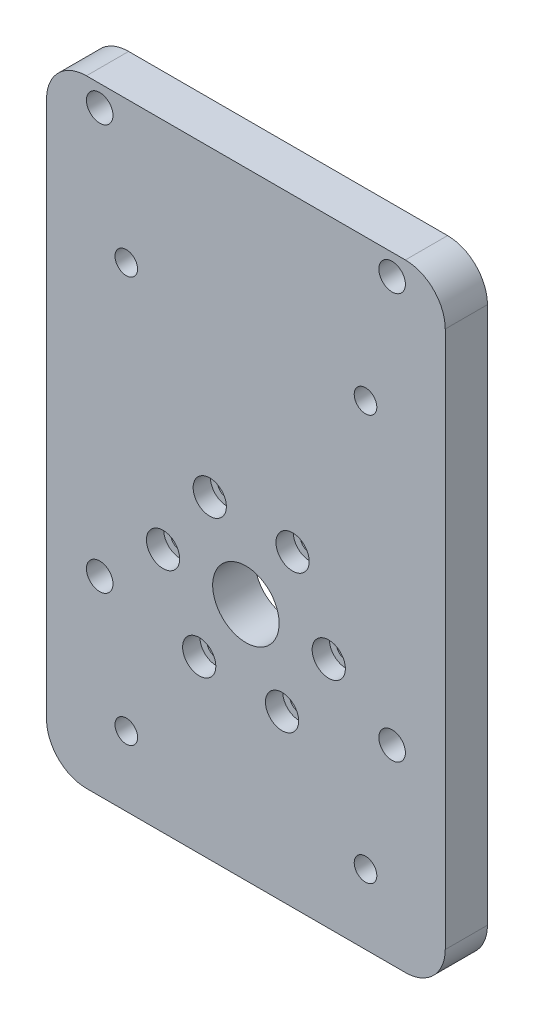
ISO-10303-21;
HEADER;
FILE_DESCRIPTION(('STEP AP214'),'2;1');
FILE_NAME('part.step','',(''),(''),'','','');
FILE_SCHEMA(('AUTOMOTIVE_DESIGN { 1 0 10303 214 1 1 1 1 }'));
ENDSEC;
DATA;
#1=APPLICATION_CONTEXT('core data for automotive mechanical design processes');
#2=APPLICATION_PROTOCOL_DEFINITION('international standard','automotive_design',2000,#1);
#3=PRODUCT_CONTEXT('',#1,'mechanical');
#4=PRODUCT('Part','Part','',(#3));
#5=PRODUCT_RELATED_PRODUCT_CATEGORY('part','',(#4));
#6=PRODUCT_DEFINITION_FORMATION('','',#4);
#7=PRODUCT_DEFINITION_CONTEXT('part definition',#1,'design');
#8=PRODUCT_DEFINITION('design','',#6,#7);
#9=PRODUCT_DEFINITION_SHAPE('','',#8);
#10=(LENGTH_UNIT() NAMED_UNIT(*) SI_UNIT(.MILLI.,.METRE.));
#11=(NAMED_UNIT(*) PLANE_ANGLE_UNIT() SI_UNIT($,.RADIAN.));
#12=(NAMED_UNIT(*) SI_UNIT($,.STERADIAN.) SOLID_ANGLE_UNIT());
#13=UNCERTAINTY_MEASURE_WITH_UNIT(LENGTH_MEASURE(1.E-05),#10,'distance_accuracy_value','');
#14=(GEOMETRIC_REPRESENTATION_CONTEXT(3) GLOBAL_UNCERTAINTY_ASSIGNED_CONTEXT((#13)) GLOBAL_UNIT_ASSIGNED_CONTEXT((#10,
#11,#12)) REPRESENTATION_CONTEXT('',''));
#15=CARTESIAN_POINT('',(0.,0.,0.));
#16=DIRECTION('',(0.,0.,1.));
#17=DIRECTION('',(1.,0.,0.));
#18=AXIS2_PLACEMENT_3D('',#15,#16,#17);
#19=CARTESIAN_POINT('',(159.426042223152,10.338507178432,275.95));
#20=DIRECTION('',(0.,0.,-1.));
#21=DIRECTION('',(-1.,0.,0.));
#22=AXIS2_PLACEMENT_3D('',#19,#20,#21);
#23=CYLINDRICAL_SURFACE('',#22,1.45000000000001);
#24=CARTESIAN_POINT('',(159.426042223152,10.338507178432,269.6));
#25=DIRECTION('',(0.,0.,1.));
#26=DIRECTION('',(1.,0.,0.));
#27=AXIS2_PLACEMENT_3D('',#24,#25,#26);
#28=CIRCLE('',#27,1.45000000000001);
#29=CARTESIAN_POINT('',(160.876042223152,10.338507178432,269.6));
#30=VERTEX_POINT('',#29);
#31=EDGE_CURVE('E153',#30,#30,#28,.T.);
#32=ORIENTED_EDGE('',*,*,#31,.F.);
#33=EDGE_LOOP('',(#32));
#34=FACE_BOUND('',#33,.T.);
#35=CARTESIAN_POINT('',(159.426042223152,10.338507178432,273.35));
#36=DIRECTION('',(0.,0.,1.));
#37=DIRECTION('',(1.,0.,0.));
#38=AXIS2_PLACEMENT_3D('',#35,#36,#37);
#39=CIRCLE('',#38,1.45000000000001);
#40=CARTESIAN_POINT('',(160.876042223152,10.338507178432,273.35));
#41=VERTEX_POINT('',#40);
#42=EDGE_CURVE('E47',#41,#41,#39,.T.);
#43=ORIENTED_EDGE('',*,*,#42,.T.);
#44=EDGE_LOOP('',(#43));
#45=FACE_BOUND('',#44,.T.);
#46=ADVANCED_FACE('F44',(#34,#45),#23,.F.);
#47=CARTESIAN_POINT('',(146.959611257846,11.2539846425274,275.95));
#48=DIRECTION('',(0.,0.,-1.));
#49=DIRECTION('',(-1.,0.,0.));
#50=AXIS2_PLACEMENT_3D('',#47,#48,#49);
#51=CYLINDRICAL_SURFACE('',#50,1.45000000000001);
#52=CARTESIAN_POINT('',(146.959611257846,11.2539846425274,269.6));
#53=DIRECTION('',(0.,0.,1.));
#54=DIRECTION('',(1.,0.,0.));
#55=AXIS2_PLACEMENT_3D('',#52,#53,#54);
#56=CIRCLE('',#55,1.45000000000001);
#57=CARTESIAN_POINT('',(148.409611257846,11.2539846425274,269.6));
#58=VERTEX_POINT('',#57);
#59=EDGE_CURVE('E245',#58,#58,#56,.T.);
#60=ORIENTED_EDGE('',*,*,#59,.F.);
#61=EDGE_LOOP('',(#60));
#62=FACE_BOUND('',#61,.T.);
#63=CARTESIAN_POINT('',(146.959611257846,11.2539846425274,273.35));
#64=DIRECTION('',(0.,0.,1.));
#65=DIRECTION('',(1.,0.,0.));
#66=AXIS2_PLACEMENT_3D('',#63,#64,#65);
#67=CIRCLE('',#66,1.45000000000001);
#68=CARTESIAN_POINT('',(148.409611257846,11.2539846425274,273.35));
#69=VERTEX_POINT('',#68);
#70=EDGE_CURVE('E207',#69,#69,#67,.T.);
#71=ORIENTED_EDGE('',*,*,#70,.T.);
#72=EDGE_LOOP('',(#71));
#73=FACE_BOUND('',#72,.T.);
#74=ADVANCED_FACE('F394',(#62,#73),#51,.F.);
#75=CARTESIAN_POINT('',(139.933569034694,0.915477464095396,275.95));
#76=DIRECTION('',(0.,0.,-1.));
#77=DIRECTION('',(-1.,0.,0.));
#78=AXIS2_PLACEMENT_3D('',#75,#76,#77);
#79=CYLINDRICAL_SURFACE('',#78,1.45000000000001);
#80=CARTESIAN_POINT('',(139.933569034694,0.915477464095396,269.6));
#81=DIRECTION('',(0.,0.,1.));
#82=DIRECTION('',(1.,0.,0.));
#83=AXIS2_PLACEMENT_3D('',#80,#81,#82);
#84=CIRCLE('',#83,1.45000000000001);
#85=CARTESIAN_POINT('',(141.383569034694,0.915477464095396,269.6));
#86=VERTEX_POINT('',#85);
#87=EDGE_CURVE('E246',#86,#86,#84,.T.);
#88=ORIENTED_EDGE('',*,*,#87,.F.);
#89=EDGE_LOOP('',(#88));
#90=FACE_BOUND('',#89,.T.);
#91=CARTESIAN_POINT('',(139.933569034694,0.915477464095396,273.35));
#92=DIRECTION('',(0.,0.,1.));
#93=DIRECTION('',(1.,0.,0.));
#94=AXIS2_PLACEMENT_3D('',#91,#92,#93);
#95=CIRCLE('',#94,1.45000000000001);
#96=CARTESIAN_POINT('',(141.383569034694,0.915477464095396,273.35));
#97=VERTEX_POINT('',#96);
#98=EDGE_CURVE('E202',#97,#97,#95,.T.);
#99=ORIENTED_EDGE('',*,*,#98,.T.);
#100=EDGE_LOOP('',(#99));
#101=FACE_BOUND('',#100,.T.);
#102=ADVANCED_FACE('F405',(#90,#101),#79,.F.);
#103=CARTESIAN_POINT('',(145.373957776848,-10.338507178432,275.95));
#104=DIRECTION('',(0.,0.,-1.));
#105=DIRECTION('',(-1.,0.,0.));
#106=AXIS2_PLACEMENT_3D('',#103,#104,#105);
#107=CYLINDRICAL_SURFACE('',#106,1.45000000000001);
#108=CARTESIAN_POINT('',(145.373957776848,-10.338507178432,269.6));
#109=DIRECTION('',(0.,0.,1.));
#110=DIRECTION('',(1.,0.,0.));
#111=AXIS2_PLACEMENT_3D('',#108,#109,#110);
#112=CIRCLE('',#111,1.45000000000001);
#113=CARTESIAN_POINT('',(146.823957776848,-10.338507178432,269.6));
#114=VERTEX_POINT('',#113);
#115=EDGE_CURVE('E249',#114,#114,#112,.T.);
#116=ORIENTED_EDGE('',*,*,#115,.F.);
#117=EDGE_LOOP('',(#116));
#118=FACE_BOUND('',#117,.T.);
#119=CARTESIAN_POINT('',(145.373957776848,-10.338507178432,273.35));
#120=DIRECTION('',(0.,0.,1.));
#121=DIRECTION('',(1.,0.,0.));
#122=AXIS2_PLACEMENT_3D('',#119,#120,#121);
#123=CIRCLE('',#122,1.45000000000001);
#124=CARTESIAN_POINT('',(146.823957776848,-10.338507178432,273.35));
#125=VERTEX_POINT('',#124);
#126=EDGE_CURVE('E198',#125,#125,#123,.T.);
#127=ORIENTED_EDGE('',*,*,#126,.T.);
#128=EDGE_LOOP('',(#127));
#129=FACE_BOUND('',#128,.T.);
#130=ADVANCED_FACE('F465',(#118,#129),#107,.F.);
#131=CARTESIAN_POINT('',(157.840388742154,-11.2539846425274,275.95));
#132=DIRECTION('',(0.,0.,-1.));
#133=DIRECTION('',(-1.,0.,0.));
#134=AXIS2_PLACEMENT_3D('',#131,#132,#133);
#135=CYLINDRICAL_SURFACE('',#134,1.45000000000001);
#136=CARTESIAN_POINT('',(157.840388742154,-11.2539846425274,269.6));
#137=DIRECTION('',(0.,0.,1.));
#138=DIRECTION('',(1.,0.,0.));
#139=AXIS2_PLACEMENT_3D('',#136,#137,#138);
#140=CIRCLE('',#139,1.45000000000001);
#141=CARTESIAN_POINT('',(159.290388742154,-11.2539846425274,269.6));
#142=VERTEX_POINT('',#141);
#143=EDGE_CURVE('E235',#142,#142,#140,.T.);
#144=ORIENTED_EDGE('',*,*,#143,.F.);
#145=EDGE_LOOP('',(#144));
#146=FACE_BOUND('',#145,.T.);
#147=CARTESIAN_POINT('',(157.840388742154,-11.2539846425274,273.35));
#148=DIRECTION('',(0.,0.,1.));
#149=DIRECTION('',(1.,0.,0.));
#150=AXIS2_PLACEMENT_3D('',#147,#148,#149);
#151=CIRCLE('',#150,1.45000000000001);
#152=CARTESIAN_POINT('',(159.290388742154,-11.2539846425274,273.35));
#153=VERTEX_POINT('',#152);
#154=EDGE_CURVE('E194',#153,#153,#151,.T.);
#155=ORIENTED_EDGE('',*,*,#154,.T.);
#156=EDGE_LOOP('',(#155));
#157=FACE_BOUND('',#156,.T.);
#158=ADVANCED_FACE('F406',(#146,#157),#135,.F.);
#159=CARTESIAN_POINT('',(164.866430965306,-0.915477464095398,275.95));
#160=DIRECTION('',(0.,0.,-1.));
#161=DIRECTION('',(-1.,0.,0.));
#162=AXIS2_PLACEMENT_3D('',#159,#160,#161);
#163=CYLINDRICAL_SURFACE('',#162,1.45000000000001);
#164=CARTESIAN_POINT('',(164.866430965306,-0.915477464095398,269.6));
#165=DIRECTION('',(0.,0.,1.));
#166=DIRECTION('',(1.,0.,0.));
#167=AXIS2_PLACEMENT_3D('',#164,#165,#166);
#168=CIRCLE('',#167,1.45000000000001);
#169=CARTESIAN_POINT('',(166.316430965306,-0.915477464095398,269.6));
#170=VERTEX_POINT('',#169);
#171=EDGE_CURVE('E226',#170,#170,#168,.T.);
#172=ORIENTED_EDGE('',*,*,#171,.F.);
#173=EDGE_LOOP('',(#172));
#174=FACE_BOUND('',#173,.T.);
#175=CARTESIAN_POINT('',(164.866430965306,-0.915477464095398,273.35));
#176=DIRECTION('',(0.,0.,1.));
#177=DIRECTION('',(1.,0.,0.));
#178=AXIS2_PLACEMENT_3D('',#175,#176,#177);
#179=CIRCLE('',#178,1.45000000000001);
#180=CARTESIAN_POINT('',(166.316430965306,-0.915477464095398,273.35));
#181=VERTEX_POINT('',#180);
#182=EDGE_CURVE('E188',#181,#181,#179,.T.);
#183=ORIENTED_EDGE('',*,*,#182,.T.);
#184=EDGE_LOOP('',(#183));
#185=FACE_BOUND('',#184,.T.);
#186=ADVANCED_FACE('F439',(#174,#185),#163,.F.);
#187=CARTESIAN_POINT('',(128.4,-30.,275.95));
#188=DIRECTION('',(0.,0.,-1.));
#189=DIRECTION('',(-1.,0.,0.));
#190=AXIS2_PLACEMENT_3D('',#187,#188,#189);
#191=CYLINDRICAL_SURFACE('',#190,6.00000000000001);
#192=CARTESIAN_POINT('',(128.4,-30.,269.6));
#193=DIRECTION('',(0.,0.,1.));
#194=DIRECTION('',(1.,0.,0.));
#195=AXIS2_PLACEMENT_3D('',#192,#193,#194);
#196=CIRCLE('',#195,6.00000000000001);
#197=CARTESIAN_POINT('',(122.4,-30.,269.6));
#198=VERTEX_POINT('',#197);
#199=CARTESIAN_POINT('',(128.4,-36.,269.6));
#200=VERTEX_POINT('',#199);
#201=EDGE_CURVE('E149',#198,#200,#196,.T.);
#202=ORIENTED_EDGE('',*,*,#201,.T.);
#203=DIRECTION('',(0.,0.,-1.));
#204=VECTOR('',#203,1.);
#205=CARTESIAN_POINT('',(128.4,-36.,275.95));
#206=LINE('',#205,#204);
#207=CARTESIAN_POINT('',(128.4,-36.,275.95));
#208=VERTEX_POINT('',#207);
#209=EDGE_CURVE('E11',#208,#200,#206,.T.);
#210=ORIENTED_EDGE('',*,*,#209,.F.);
#211=CARTESIAN_POINT('',(128.4,-30.,275.95));
#212=DIRECTION('',(0.,0.,1.));
#213=DIRECTION('',(1.,0.,0.));
#214=AXIS2_PLACEMENT_3D('',#211,#212,#213);
#215=CIRCLE('',#214,6.00000000000001);
#216=CARTESIAN_POINT('',(122.4,-30.,275.95));
#217=VERTEX_POINT('',#216);
#218=EDGE_CURVE('E175',#217,#208,#215,.T.);
#219=ORIENTED_EDGE('',*,*,#218,.F.);
#220=DIRECTION('',(0.,0.,-1.));
#221=VECTOR('',#220,1.);
#222=CARTESIAN_POINT('',(122.4,-30.,275.95));
#223=LINE('',#222,#221);
#224=EDGE_CURVE('E143',#217,#198,#223,.T.);
#225=ORIENTED_EDGE('',*,*,#224,.T.);
#226=EDGE_LOOP('',(#202,#210,#219,#225));
#227=FACE_BOUND('',#226,.T.);
#228=ADVANCED_FACE('F50',(#227),#191,.T.);
#229=CARTESIAN_POINT('',(128.4,-36.,275.95));
#230=DIRECTION('',(0.,1.,0.));
#231=DIRECTION('',(0.,0.,1.));
#232=AXIS2_PLACEMENT_3D('',#229,#230,#231);
#233=PLANE('',#232);
#234=DIRECTION('',(1.,0.,0.));
#235=VECTOR('',#234,1.);
#236=CARTESIAN_POINT('',(128.4,-36.,269.6));
#237=LINE('',#236,#235);
#238=CARTESIAN_POINT('',(176.4,-36.,269.6));
#239=VERTEX_POINT('',#238);
#240=EDGE_CURVE('E152',#200,#239,#237,.T.);
#241=ORIENTED_EDGE('',*,*,#240,.T.);
#242=DIRECTION('',(0.,0.,-1.));
#243=VECTOR('',#242,1.);
#244=CARTESIAN_POINT('',(176.4,-36.,275.95));
#245=LINE('',#244,#243);
#246=CARTESIAN_POINT('',(176.4,-36.,275.95));
#247=VERTEX_POINT('',#246);
#248=EDGE_CURVE('E57',#247,#239,#245,.T.);
#249=ORIENTED_EDGE('',*,*,#248,.F.);
#250=DIRECTION('',(1.,0.,0.));
#251=VECTOR('',#250,1.);
#252=CARTESIAN_POINT('',(128.4,-36.,275.95));
#253=LINE('',#252,#251);
#254=EDGE_CURVE('E108',#208,#247,#253,.T.);
#255=ORIENTED_EDGE('',*,*,#254,.F.);
#256=ORIENTED_EDGE('',*,*,#209,.T.);
#257=EDGE_LOOP('',(#241,#249,#255,#256));
#258=FACE_BOUND('',#257,.T.);
#259=ADVANCED_FACE('F432',(#258),#233,.F.);
#260=CARTESIAN_POINT('',(176.4,-30.,275.95));
#261=DIRECTION('',(0.,0.,-1.));
#262=DIRECTION('',(-1.,0.,0.));
#263=AXIS2_PLACEMENT_3D('',#260,#261,#262);
#264=CYLINDRICAL_SURFACE('',#263,6.00000000000001);
#265=CARTESIAN_POINT('',(176.4,-30.,269.6));
#266=DIRECTION('',(0.,0.,1.));
#267=DIRECTION('',(1.,0.,0.));
#268=AXIS2_PLACEMENT_3D('',#265,#266,#267);
#269=CIRCLE('',#268,6.00000000000001);
#270=CARTESIAN_POINT('',(182.4,-30.,269.6));
#271=VERTEX_POINT('',#270);
#272=EDGE_CURVE('E160',#239,#271,#269,.T.);
#273=ORIENTED_EDGE('',*,*,#272,.T.);
#274=DIRECTION('',(0.,0.,-1.));
#275=VECTOR('',#274,1.);
#276=CARTESIAN_POINT('',(182.4,-30.,275.95));
#277=LINE('',#276,#275);
#278=CARTESIAN_POINT('',(182.4,-30.,275.95));
#279=VERTEX_POINT('',#278);
#280=EDGE_CURVE('E182',#279,#271,#277,.T.);
#281=ORIENTED_EDGE('',*,*,#280,.F.);
#282=CARTESIAN_POINT('',(176.4,-30.,275.95));
#283=DIRECTION('',(0.,0.,1.));
#284=DIRECTION('',(1.,0.,0.));
#285=AXIS2_PLACEMENT_3D('',#282,#283,#284);
#286=CIRCLE('',#285,6.00000000000001);
#287=EDGE_CURVE('E263',#247,#279,#286,.T.);
#288=ORIENTED_EDGE('',*,*,#287,.F.);
#289=ORIENTED_EDGE('',*,*,#248,.T.);
#290=EDGE_LOOP('',(#273,#281,#288,#289));
#291=FACE_BOUND('',#290,.T.);
#292=ADVANCED_FACE('F431',(#291),#264,.T.);
#293=CARTESIAN_POINT('',(182.4,-30.,275.95));
#294=DIRECTION('',(-1.,0.,0.));
#295=DIRECTION('',(0.,0.,1.));
#296=AXIS2_PLACEMENT_3D('',#293,#294,#295);
#297=PLANE('',#296);
#298=DIRECTION('',(0.,1.,0.));
#299=VECTOR('',#298,1.);
#300=CARTESIAN_POINT('',(182.4,-30.,269.6));
#301=LINE('',#300,#299);
#302=CARTESIAN_POINT('',(182.4,50.875,269.6));
#303=VERTEX_POINT('',#302);
#304=EDGE_CURVE('E159',#271,#303,#301,.T.);
#305=ORIENTED_EDGE('',*,*,#304,.T.);
#306=DIRECTION('',(0.,0.,-1.));
#307=VECTOR('',#306,1.);
#308=CARTESIAN_POINT('',(182.4,50.875,275.95));
#309=LINE('',#308,#307);
#310=CARTESIAN_POINT('',(182.4,50.875,275.95));
#311=VERTEX_POINT('',#310);
#312=EDGE_CURVE('E177',#311,#303,#309,.T.);
#313=ORIENTED_EDGE('',*,*,#312,.F.);
#314=DIRECTION('',(0.,1.,0.));
#315=VECTOR('',#314,1.);
#316=CARTESIAN_POINT('',(182.4,-30.,275.95));
#317=LINE('',#316,#315);
#318=EDGE_CURVE('E270',#279,#311,#317,.T.);
#319=ORIENTED_EDGE('',*,*,#318,.F.);
#320=ORIENTED_EDGE('',*,*,#280,.T.);
#321=EDGE_LOOP('',(#305,#313,#319,#320));
#322=FACE_BOUND('',#321,.T.);
#323=ADVANCED_FACE('F430',(#322),#297,.F.);
#324=CARTESIAN_POINT('',(176.4,50.875,275.95));
#325=DIRECTION('',(0.,0.,-1.));
#326=DIRECTION('',(-1.,0.,0.));
#327=AXIS2_PLACEMENT_3D('',#324,#325,#326);
#328=CYLINDRICAL_SURFACE('',#327,6.);
#329=CARTESIAN_POINT('',(176.4,50.875,269.6));
#330=DIRECTION('',(0.,0.,1.));
#331=DIRECTION('',(1.,0.,0.));
#332=AXIS2_PLACEMENT_3D('',#329,#330,#331);
#333=CIRCLE('',#332,6.);
#334=CARTESIAN_POINT('',(176.4,56.875,269.6));
#335=VERTEX_POINT('',#334);
#336=EDGE_CURVE('E161',#303,#335,#333,.T.);
#337=ORIENTED_EDGE('',*,*,#336,.T.);
#338=DIRECTION('',(0.,0.,-1.));
#339=VECTOR('',#338,1.);
#340=CARTESIAN_POINT('',(176.4,56.875,275.95));
#341=LINE('',#340,#339);
#342=CARTESIAN_POINT('',(176.4,56.875,275.95));
#343=VERTEX_POINT('',#342);
#344=EDGE_CURVE('E137',#343,#335,#341,.T.);
#345=ORIENTED_EDGE('',*,*,#344,.F.);
#346=CARTESIAN_POINT('',(176.4,50.875,275.95));
#347=DIRECTION('',(0.,0.,1.));
#348=DIRECTION('',(1.,0.,0.));
#349=AXIS2_PLACEMENT_3D('',#346,#347,#348);
#350=CIRCLE('',#349,6.);
#351=EDGE_CURVE('E130',#311,#343,#350,.T.);
#352=ORIENTED_EDGE('',*,*,#351,.F.);
#353=ORIENTED_EDGE('',*,*,#312,.T.);
#354=EDGE_LOOP('',(#337,#345,#352,#353));
#355=FACE_BOUND('',#354,.T.);
#356=ADVANCED_FACE('F425',(#355),#328,.T.);
#357=CARTESIAN_POINT('',(176.4,56.875,275.95));
#358=DIRECTION('',(0.,-1.,0.));
#359=DIRECTION('',(0.,0.,-1.));
#360=AXIS2_PLACEMENT_3D('',#357,#358,#359);
#361=PLANE('',#360);
#362=DIRECTION('',(-1.,0.,0.));
#363=VECTOR('',#362,1.);
#364=CARTESIAN_POINT('',(176.4,56.875,269.6));
#365=LINE('',#364,#363);
#366=CARTESIAN_POINT('',(128.4,56.875,269.6));
#367=VERTEX_POINT('',#366);
#368=EDGE_CURVE('E136',#335,#367,#365,.T.);
#369=ORIENTED_EDGE('',*,*,#368,.T.);
#370=DIRECTION('',(0.,0.,-1.));
#371=VECTOR('',#370,1.);
#372=CARTESIAN_POINT('',(128.4,56.875,275.95));
#373=LINE('',#372,#371);
#374=CARTESIAN_POINT('',(128.4,56.875,275.95));
#375=VERTEX_POINT('',#374);
#376=EDGE_CURVE('E132',#375,#367,#373,.T.);
#377=ORIENTED_EDGE('',*,*,#376,.F.);
#378=DIRECTION('',(-1.,0.,0.));
#379=VECTOR('',#378,1.);
#380=CARTESIAN_POINT('',(176.4,56.875,275.95));
#381=LINE('',#380,#379);
#382=EDGE_CURVE('E122',#343,#375,#381,.T.);
#383=ORIENTED_EDGE('',*,*,#382,.F.);
#384=ORIENTED_EDGE('',*,*,#344,.T.);
#385=EDGE_LOOP('',(#369,#377,#383,#384));
#386=FACE_BOUND('',#385,.T.);
#387=ADVANCED_FACE('F133',(#386),#361,.F.);
#388=CARTESIAN_POINT('',(128.4,50.875,275.95));
#389=DIRECTION('',(0.,0.,-1.));
#390=DIRECTION('',(-1.,0.,0.));
#391=AXIS2_PLACEMENT_3D('',#388,#389,#390);
#392=CYLINDRICAL_SURFACE('',#391,6.);
#393=CARTESIAN_POINT('',(128.4,50.875,269.6));
#394=DIRECTION('',(0.,0.,1.));
#395=DIRECTION('',(1.,0.,0.));
#396=AXIS2_PLACEMENT_3D('',#393,#394,#395);
#397=CIRCLE('',#396,6.);
#398=CARTESIAN_POINT('',(122.4,50.875,269.6));
#399=VERTEX_POINT('',#398);
#400=EDGE_CURVE('E93',#367,#399,#397,.T.);
#401=ORIENTED_EDGE('',*,*,#400,.T.);
#402=DIRECTION('',(0.,0.,-1.));
#403=VECTOR('',#402,1.);
#404=CARTESIAN_POINT('',(122.4,50.875,275.95));
#405=LINE('',#404,#403);
#406=CARTESIAN_POINT('',(122.4,50.875,275.95));
#407=VERTEX_POINT('',#406);
#408=EDGE_CURVE('E138',#407,#399,#405,.T.);
#409=ORIENTED_EDGE('',*,*,#408,.F.);
#410=CARTESIAN_POINT('',(128.4,50.875,275.95));
#411=DIRECTION('',(0.,0.,1.));
#412=DIRECTION('',(1.,0.,0.));
#413=AXIS2_PLACEMENT_3D('',#410,#411,#412);
#414=CIRCLE('',#413,6.);
#415=EDGE_CURVE('E123',#375,#407,#414,.T.);
#416=ORIENTED_EDGE('',*,*,#415,.F.);
#417=ORIENTED_EDGE('',*,*,#376,.T.);
#418=EDGE_LOOP('',(#401,#409,#416,#417));
#419=FACE_BOUND('',#418,.T.);
#420=ADVANCED_FACE('F142',(#419),#392,.T.);
#421=CARTESIAN_POINT('',(122.4,50.875,275.95));
#422=DIRECTION('',(1.,0.,0.));
#423=DIRECTION('',(0.,0.,-1.));
#424=AXIS2_PLACEMENT_3D('',#421,#422,#423);
#425=PLANE('',#424);
#426=DIRECTION('',(0.,-1.,0.));
#427=VECTOR('',#426,1.);
#428=CARTESIAN_POINT('',(122.4,50.875,269.6));
#429=LINE('',#428,#427);
#430=EDGE_CURVE('E99',#399,#198,#429,.T.);
#431=ORIENTED_EDGE('',*,*,#430,.T.);
#432=ORIENTED_EDGE('',*,*,#224,.F.);
#433=DIRECTION('',(0.,-1.,0.));
#434=VECTOR('',#433,1.);
#435=CARTESIAN_POINT('',(122.4,50.875,275.95));
#436=LINE('',#435,#434);
#437=EDGE_CURVE('E62',#407,#217,#436,.T.);
#438=ORIENTED_EDGE('',*,*,#437,.F.);
#439=ORIENTED_EDGE('',*,*,#408,.T.);
#440=EDGE_LOOP('',(#431,#432,#438,#439));
#441=FACE_BOUND('',#440,.T.);
#442=ADVANCED_FACE('F415',(#441),#425,.F.);
#443=CARTESIAN_POINT('',(128.4,-30.,275.95));
#444=DIRECTION('',(0.,0.,1.));
#445=DIRECTION('',(1.,0.,0.));
#446=AXIS2_PLACEMENT_3D('',#443,#444,#445);
#447=PLANE('',#446);
#448=CARTESIAN_POINT('',(134.4,-25.525,275.95));
#449=DIRECTION('',(0.,0.,1.));
#450=DIRECTION('',(1.,0.,0.));
#451=AXIS2_PLACEMENT_3D('',#448,#449,#450);
#452=CIRCLE('',#451,1.70000000000001);
#453=CARTESIAN_POINT('',(136.1,-25.525,275.95));
#454=VERTEX_POINT('',#453);
#455=EDGE_CURVE('E360',#454,#454,#452,.T.);
#456=ORIENTED_EDGE('',*,*,#455,.F.);
#457=EDGE_LOOP('',(#456));
#458=FACE_BOUND('',#457,.T.);
#459=CARTESIAN_POINT('',(170.4,35.525,275.95));
#460=DIRECTION('',(0.,0.,1.));
#461=DIRECTION('',(1.,0.,0.));
#462=AXIS2_PLACEMENT_3D('',#459,#460,#461);
#463=CIRCLE('',#462,1.70000000000001);
#464=CARTESIAN_POINT('',(172.1,35.525,275.95));
#465=VERTEX_POINT('',#464);
#466=EDGE_CURVE('E349',#465,#465,#463,.T.);
#467=ORIENTED_EDGE('',*,*,#466,.F.);
#468=EDGE_LOOP('',(#467));
#469=FACE_BOUND('',#468,.T.);
#470=CARTESIAN_POINT('',(170.4,-25.525,275.95));
#471=DIRECTION('',(0.,0.,1.));
#472=DIRECTION('',(1.,0.,0.));
#473=AXIS2_PLACEMENT_3D('',#470,#471,#472);
#474=CIRCLE('',#473,1.70000000000001);
#475=CARTESIAN_POINT('',(172.1,-25.525,275.95));
#476=VERTEX_POINT('',#475);
#477=EDGE_CURVE('E366',#476,#476,#474,.T.);
#478=ORIENTED_EDGE('',*,*,#477,.F.);
#479=EDGE_LOOP('',(#478));
#480=FACE_BOUND('',#479,.T.);
#481=CARTESIAN_POINT('',(134.4,35.525,275.95));
#482=DIRECTION('',(0.,0.,1.));
#483=DIRECTION('',(1.,0.,0.));
#484=AXIS2_PLACEMENT_3D('',#481,#482,#483);
#485=CIRCLE('',#484,1.70000000000001);
#486=CARTESIAN_POINT('',(136.1,35.525,275.95));
#487=VERTEX_POINT('',#486);
#488=EDGE_CURVE('E310',#487,#487,#485,.T.);
#489=ORIENTED_EDGE('',*,*,#488,.F.);
#490=EDGE_LOOP('',(#489));
#491=FACE_BOUND('',#490,.T.);
#492=CARTESIAN_POINT('',(164.866430965306,-0.915477464095398,275.95));
#493=DIRECTION('',(0.,0.,1.));
#494=DIRECTION('',(1.,0.,0.));
#495=AXIS2_PLACEMENT_3D('',#492,#493,#494);
#496=CIRCLE('',#495,2.5);
#497=CARTESIAN_POINT('',(167.366430965306,-0.915477464095398,275.95));
#498=VERTEX_POINT('',#497);
#499=EDGE_CURVE('E305',#498,#498,#496,.T.);
#500=ORIENTED_EDGE('',*,*,#499,.F.);
#501=EDGE_LOOP('',(#500));
#502=FACE_BOUND('',#501,.T.);
#503=CARTESIAN_POINT('',(157.840388742154,-11.2539846425274,275.95));
#504=DIRECTION('',(0.,0.,1.));
#505=DIRECTION('',(1.,0.,0.));
#506=AXIS2_PLACEMENT_3D('',#503,#504,#505);
#507=CIRCLE('',#506,2.5);
#508=CARTESIAN_POINT('',(160.340388742154,-11.2539846425274,275.95));
#509=VERTEX_POINT('',#508);
#510=EDGE_CURVE('E311',#509,#509,#507,.T.);
#511=ORIENTED_EDGE('',*,*,#510,.F.);
#512=EDGE_LOOP('',(#511));
#513=FACE_BOUND('',#512,.T.);
#514=CARTESIAN_POINT('',(145.373957776848,-10.338507178432,275.95));
#515=DIRECTION('',(0.,0.,1.));
#516=DIRECTION('',(1.,0.,0.));
#517=AXIS2_PLACEMENT_3D('',#514,#515,#516);
#518=CIRCLE('',#517,2.5);
#519=CARTESIAN_POINT('',(147.873957776848,-10.338507178432,275.95));
#520=VERTEX_POINT('',#519);
#521=EDGE_CURVE('E316',#520,#520,#518,.T.);
#522=ORIENTED_EDGE('',*,*,#521,.F.);
#523=EDGE_LOOP('',(#522));
#524=FACE_BOUND('',#523,.T.);
#525=CARTESIAN_POINT('',(139.933569034694,0.915477464095396,275.95));
#526=DIRECTION('',(0.,0.,1.));
#527=DIRECTION('',(1.,0.,0.));
#528=AXIS2_PLACEMENT_3D('',#525,#526,#527);
#529=CIRCLE('',#528,2.5);
#530=CARTESIAN_POINT('',(142.433569034694,0.915477464095396,275.95));
#531=VERTEX_POINT('',#530);
#532=EDGE_CURVE('E330',#531,#531,#529,.T.);
#533=ORIENTED_EDGE('',*,*,#532,.F.);
#534=EDGE_LOOP('',(#533));
#535=FACE_BOUND('',#534,.T.);
#536=CARTESIAN_POINT('',(146.959611257846,11.2539846425274,275.95));
#537=DIRECTION('',(0.,0.,1.));
#538=DIRECTION('',(1.,0.,0.));
#539=AXIS2_PLACEMENT_3D('',#536,#537,#538);
#540=CIRCLE('',#539,2.5);
#541=CARTESIAN_POINT('',(149.459611257846,11.2539846425274,275.95));
#542=VERTEX_POINT('',#541);
#543=EDGE_CURVE('E334',#542,#542,#540,.T.);
#544=ORIENTED_EDGE('',*,*,#543,.F.);
#545=EDGE_LOOP('',(#544));
#546=FACE_BOUND('',#545,.T.);
#547=CARTESIAN_POINT('',(159.426042223152,10.338507178432,275.95));
#548=DIRECTION('',(0.,0.,1.));
#549=DIRECTION('',(1.,0.,0.));
#550=AXIS2_PLACEMENT_3D('',#547,#548,#549);
#551=CIRCLE('',#550,2.5);
#552=CARTESIAN_POINT('',(161.926042223152,10.338507178432,275.95));
#553=VERTEX_POINT('',#552);
#554=EDGE_CURVE('E192',#553,#553,#551,.T.);
#555=ORIENTED_EDGE('',*,*,#554,.F.);
#556=EDGE_LOOP('',(#555));
#557=FACE_BOUND('',#556,.T.);
#558=CARTESIAN_POINT('',(152.4,0.,275.95));
#559=DIRECTION('',(0.,0.,1.));
#560=DIRECTION('',(1.,0.,0.));
#561=AXIS2_PLACEMENT_3D('',#558,#559,#560);
#562=CIRCLE('',#561,5.);
#563=CARTESIAN_POINT('',(157.4,0.,275.95));
#564=VERTEX_POINT('',#563);
#565=EDGE_CURVE('E240',#564,#564,#562,.T.);
#566=ORIENTED_EDGE('',*,*,#565,.F.);
#567=EDGE_LOOP('',(#566));
#568=FACE_BOUND('',#567,.T.);
#569=CARTESIAN_POINT('',(130.4,53.7,275.95));
#570=DIRECTION('',(0.,0.,1.));
#571=DIRECTION('',(1.,0.,0.));
#572=AXIS2_PLACEMENT_3D('',#569,#570,#571);
#573=CIRCLE('',#572,2.);
#574=CARTESIAN_POINT('',(132.4,53.7,275.95));
#575=VERTEX_POINT('',#574);
#576=EDGE_CURVE('E271',#575,#575,#573,.T.);
#577=ORIENTED_EDGE('',*,*,#576,.F.);
#578=EDGE_LOOP('',(#577));
#579=FACE_BOUND('',#578,.T.);
#580=CARTESIAN_POINT('',(130.4,-7.35,275.95));
#581=DIRECTION('',(0.,0.,1.));
#582=DIRECTION('',(1.,0.,0.));
#583=AXIS2_PLACEMENT_3D('',#580,#581,#582);
#584=CIRCLE('',#583,2.);
#585=CARTESIAN_POINT('',(132.4,-7.35,275.95));
#586=VERTEX_POINT('',#585);
#587=EDGE_CURVE('E281',#586,#586,#584,.T.);
#588=ORIENTED_EDGE('',*,*,#587,.F.);
#589=EDGE_LOOP('',(#588));
#590=FACE_BOUND('',#589,.T.);
#591=CARTESIAN_POINT('',(174.4,53.7,275.95));
#592=DIRECTION('',(0.,0.,1.));
#593=DIRECTION('',(1.,0.,0.));
#594=AXIS2_PLACEMENT_3D('',#591,#592,#593);
#595=CIRCLE('',#594,2.);
#596=CARTESIAN_POINT('',(176.4,53.7,275.95));
#597=VERTEX_POINT('',#596);
#598=EDGE_CURVE('E223',#597,#597,#595,.T.);
#599=ORIENTED_EDGE('',*,*,#598,.F.);
#600=EDGE_LOOP('',(#599));
#601=FACE_BOUND('',#600,.T.);
#602=CARTESIAN_POINT('',(174.4,-7.35,275.95));
#603=DIRECTION('',(0.,0.,1.));
#604=DIRECTION('',(1.,0.,0.));
#605=AXIS2_PLACEMENT_3D('',#602,#603,#604);
#606=CIRCLE('',#605,2.);
#607=CARTESIAN_POINT('',(176.4,-7.35,275.95));
#608=VERTEX_POINT('',#607);
#609=EDGE_CURVE('E211',#608,#608,#606,.T.);
#610=ORIENTED_EDGE('',*,*,#609,.F.);
#611=EDGE_LOOP('',(#610));
#612=FACE_BOUND('',#611,.T.);
#613=ORIENTED_EDGE('',*,*,#218,.T.);
#614=ORIENTED_EDGE('',*,*,#254,.T.);
#615=ORIENTED_EDGE('',*,*,#287,.T.);
#616=ORIENTED_EDGE('',*,*,#318,.T.);
#617=ORIENTED_EDGE('',*,*,#351,.T.);
#618=ORIENTED_EDGE('',*,*,#382,.T.);
#619=ORIENTED_EDGE('',*,*,#415,.T.);
#620=ORIENTED_EDGE('',*,*,#437,.T.);
#621=EDGE_LOOP('',(#613,#614,#615,#616,#617,#618,#619,#620));
#622=FACE_BOUND('',#621,.T.);
#623=ADVANCED_FACE('F124',(#458,#469,#480,#491,#502,#513,#524,#535,#546,#557,#568,#579,#590,
#601,#612,#622),#447,.T.);
#624=CARTESIAN_POINT('',(128.4,-30.,269.6));
#625=DIRECTION('',(0.,0.,1.));
#626=DIRECTION('',(1.,0.,0.));
#627=AXIS2_PLACEMENT_3D('',#624,#625,#626);
#628=PLANE('',#627);
#629=CARTESIAN_POINT('',(134.4,-25.525,269.6));
#630=DIRECTION('',(0.,0.,1.));
#631=DIRECTION('',(1.,0.,0.));
#632=AXIS2_PLACEMENT_3D('',#629,#630,#631);
#633=CIRCLE('',#632,1.70000000000001);
#634=CARTESIAN_POINT('',(136.1,-25.525,269.6));
#635=VERTEX_POINT('',#634);
#636=EDGE_CURVE('E346',#635,#635,#633,.T.);
#637=ORIENTED_EDGE('',*,*,#636,.T.);
#638=EDGE_LOOP('',(#637));
#639=FACE_BOUND('',#638,.T.);
#640=CARTESIAN_POINT('',(170.4,35.525,269.6));
#641=DIRECTION('',(0.,0.,1.));
#642=DIRECTION('',(1.,0.,0.));
#643=AXIS2_PLACEMENT_3D('',#640,#641,#642);
#644=CIRCLE('',#643,1.70000000000001);
#645=CARTESIAN_POINT('',(172.1,35.525,269.6));
#646=VERTEX_POINT('',#645);
#647=EDGE_CURVE('E353',#646,#646,#644,.T.);
#648=ORIENTED_EDGE('',*,*,#647,.T.);
#649=EDGE_LOOP('',(#648));
#650=FACE_BOUND('',#649,.T.);
#651=CARTESIAN_POINT('',(170.4,-25.525,269.6));
#652=DIRECTION('',(0.,0.,1.));
#653=DIRECTION('',(1.,0.,0.));
#654=AXIS2_PLACEMENT_3D('',#651,#652,#653);
#655=CIRCLE('',#654,1.70000000000001);
#656=CARTESIAN_POINT('',(172.1,-25.525,269.6));
#657=VERTEX_POINT('',#656);
#658=EDGE_CURVE('E354',#657,#657,#655,.T.);
#659=ORIENTED_EDGE('',*,*,#658,.T.);
#660=EDGE_LOOP('',(#659));
#661=FACE_BOUND('',#660,.T.);
#662=CARTESIAN_POINT('',(134.4,35.525,269.6));
#663=DIRECTION('',(0.,0.,1.));
#664=DIRECTION('',(1.,0.,0.));
#665=AXIS2_PLACEMENT_3D('',#662,#663,#664);
#666=CIRCLE('',#665,1.70000000000001);
#667=CARTESIAN_POINT('',(136.1,35.525,269.6));
#668=VERTEX_POINT('',#667);
#669=EDGE_CURVE('E345',#668,#668,#666,.T.);
#670=ORIENTED_EDGE('',*,*,#669,.T.);
#671=EDGE_LOOP('',(#670));
#672=FACE_BOUND('',#671,.T.);
#673=CARTESIAN_POINT('',(152.4,0.,269.6));
#674=DIRECTION('',(0.,0.,1.));
#675=DIRECTION('',(1.,0.,0.));
#676=AXIS2_PLACEMENT_3D('',#673,#674,#675);
#677=CIRCLE('',#676,5.);
#678=CARTESIAN_POINT('',(157.4,0.,269.6));
#679=VERTEX_POINT('',#678);
#680=EDGE_CURVE('E231',#679,#679,#677,.T.);
#681=ORIENTED_EDGE('',*,*,#680,.T.);
#682=EDGE_LOOP('',(#681));
#683=FACE_BOUND('',#682,.T.);
#684=ORIENTED_EDGE('',*,*,#171,.T.);
#685=EDGE_LOOP('',(#684));
#686=FACE_BOUND('',#685,.T.);
#687=ORIENTED_EDGE('',*,*,#143,.T.);
#688=EDGE_LOOP('',(#687));
#689=FACE_BOUND('',#688,.T.);
#690=ORIENTED_EDGE('',*,*,#115,.T.);
#691=EDGE_LOOP('',(#690));
#692=FACE_BOUND('',#691,.T.);
#693=ORIENTED_EDGE('',*,*,#87,.T.);
#694=EDGE_LOOP('',(#693));
#695=FACE_BOUND('',#694,.T.);
#696=ORIENTED_EDGE('',*,*,#59,.T.);
#697=EDGE_LOOP('',(#696));
#698=FACE_BOUND('',#697,.T.);
#699=CARTESIAN_POINT('',(130.4,53.7,269.6));
#700=DIRECTION('',(0.,0.,1.));
#701=DIRECTION('',(1.,0.,0.));
#702=AXIS2_PLACEMENT_3D('',#699,#700,#701);
#703=CIRCLE('',#702,2.);
#704=CARTESIAN_POINT('',(132.4,53.7,269.6));
#705=VERTEX_POINT('',#704);
#706=EDGE_CURVE('E241',#705,#705,#703,.T.);
#707=ORIENTED_EDGE('',*,*,#706,.T.);
#708=EDGE_LOOP('',(#707));
#709=FACE_BOUND('',#708,.T.);
#710=CARTESIAN_POINT('',(130.4,-7.35,269.6));
#711=DIRECTION('',(0.,0.,1.));
#712=DIRECTION('',(1.,0.,0.));
#713=AXIS2_PLACEMENT_3D('',#710,#711,#712);
#714=CIRCLE('',#713,2.);
#715=CARTESIAN_POINT('',(132.4,-7.35,269.6));
#716=VERTEX_POINT('',#715);
#717=EDGE_CURVE('E280',#716,#716,#714,.T.);
#718=ORIENTED_EDGE('',*,*,#717,.T.);
#719=EDGE_LOOP('',(#718));
#720=FACE_BOUND('',#719,.T.);
#721=CARTESIAN_POINT('',(174.4,53.7,269.6));
#722=DIRECTION('',(0.,0.,1.));
#723=DIRECTION('',(1.,0.,0.));
#724=AXIS2_PLACEMENT_3D('',#721,#722,#723);
#725=CIRCLE('',#724,2.);
#726=CARTESIAN_POINT('',(176.4,53.7,269.6));
#727=VERTEX_POINT('',#726);
#728=EDGE_CURVE('E284',#727,#727,#725,.T.);
#729=ORIENTED_EDGE('',*,*,#728,.T.);
#730=EDGE_LOOP('',(#729));
#731=FACE_BOUND('',#730,.T.);
#732=CARTESIAN_POINT('',(174.4,-7.35,269.6));
#733=DIRECTION('',(0.,0.,1.));
#734=DIRECTION('',(1.,0.,0.));
#735=AXIS2_PLACEMENT_3D('',#732,#733,#734);
#736=CIRCLE('',#735,2.);
#737=CARTESIAN_POINT('',(176.4,-7.35,269.6));
#738=VERTEX_POINT('',#737);
#739=EDGE_CURVE('E217',#738,#738,#736,.T.);
#740=ORIENTED_EDGE('',*,*,#739,.T.);
#741=EDGE_LOOP('',(#740));
#742=FACE_BOUND('',#741,.T.);
#743=ORIENTED_EDGE('',*,*,#31,.T.);
#744=EDGE_LOOP('',(#743));
#745=FACE_BOUND('',#744,.T.);
#746=ORIENTED_EDGE('',*,*,#201,.F.);
#747=ORIENTED_EDGE('',*,*,#430,.F.);
#748=ORIENTED_EDGE('',*,*,#400,.F.);
#749=ORIENTED_EDGE('',*,*,#368,.F.);
#750=ORIENTED_EDGE('',*,*,#336,.F.);
#751=ORIENTED_EDGE('',*,*,#304,.F.);
#752=ORIENTED_EDGE('',*,*,#272,.F.);
#753=ORIENTED_EDGE('',*,*,#240,.F.);
#754=EDGE_LOOP('',(#746,#747,#748,#749,#750,#751,#752,#753));
#755=FACE_BOUND('',#754,.T.);
#756=ADVANCED_FACE('F372',(#639,#650,#661,#672,#683,#686,#689,#692,#695,#698,#709,#720,#731,
#742,#745,#755),#628,.F.);
#757=CARTESIAN_POINT('',(174.4,-7.35,275.95));
#758=DIRECTION('',(0.,0.,-1.));
#759=DIRECTION('',(-1.,0.,0.));
#760=AXIS2_PLACEMENT_3D('',#757,#758,#759);
#761=CYLINDRICAL_SURFACE('',#760,2.);
#762=ORIENTED_EDGE('',*,*,#609,.T.);
#763=EDGE_LOOP('',(#762));
#764=FACE_BOUND('',#763,.T.);
#765=ORIENTED_EDGE('',*,*,#739,.F.);
#766=EDGE_LOOP('',(#765));
#767=FACE_BOUND('',#766,.T.);
#768=ADVANCED_FACE('F416',(#764,#767),#761,.F.);
#769=CARTESIAN_POINT('',(174.4,53.7,275.95));
#770=DIRECTION('',(0.,0.,-1.));
#771=DIRECTION('',(-1.,0.,0.));
#772=AXIS2_PLACEMENT_3D('',#769,#770,#771);
#773=CYLINDRICAL_SURFACE('',#772,2.);
#774=ORIENTED_EDGE('',*,*,#598,.T.);
#775=EDGE_LOOP('',(#774));
#776=FACE_BOUND('',#775,.T.);
#777=ORIENTED_EDGE('',*,*,#728,.F.);
#778=EDGE_LOOP('',(#777));
#779=FACE_BOUND('',#778,.T.);
#780=ADVANCED_FACE('F527',(#776,#779),#773,.F.);
#781=CARTESIAN_POINT('',(130.4,-7.35,275.95));
#782=DIRECTION('',(0.,0.,-1.));
#783=DIRECTION('',(-1.,0.,0.));
#784=AXIS2_PLACEMENT_3D('',#781,#782,#783);
#785=CYLINDRICAL_SURFACE('',#784,2.);
#786=ORIENTED_EDGE('',*,*,#587,.T.);
#787=EDGE_LOOP('',(#786));
#788=FACE_BOUND('',#787,.T.);
#789=ORIENTED_EDGE('',*,*,#717,.F.);
#790=EDGE_LOOP('',(#789));
#791=FACE_BOUND('',#790,.T.);
#792=ADVANCED_FACE('F524',(#788,#791),#785,.F.);
#793=CARTESIAN_POINT('',(130.4,53.7,275.95));
#794=DIRECTION('',(0.,0.,-1.));
#795=DIRECTION('',(-1.,0.,0.));
#796=AXIS2_PLACEMENT_3D('',#793,#794,#795);
#797=CYLINDRICAL_SURFACE('',#796,2.);
#798=ORIENTED_EDGE('',*,*,#576,.T.);
#799=EDGE_LOOP('',(#798));
#800=FACE_BOUND('',#799,.T.);
#801=ORIENTED_EDGE('',*,*,#706,.F.);
#802=EDGE_LOOP('',(#801));
#803=FACE_BOUND('',#802,.T.);
#804=ADVANCED_FACE('F473',(#800,#803),#797,.F.);
#805=CARTESIAN_POINT('',(152.4,0.,275.95));
#806=DIRECTION('',(0.,0.,-1.));
#807=DIRECTION('',(-1.,0.,0.));
#808=AXIS2_PLACEMENT_3D('',#805,#806,#807);
#809=CYLINDRICAL_SURFACE('',#808,5.);
#810=ORIENTED_EDGE('',*,*,#565,.T.);
#811=EDGE_LOOP('',(#810));
#812=FACE_BOUND('',#811,.T.);
#813=ORIENTED_EDGE('',*,*,#680,.F.);
#814=EDGE_LOOP('',(#813));
#815=FACE_BOUND('',#814,.T.);
#816=ADVANCED_FACE('F469',(#812,#815),#809,.F.);
#817=CARTESIAN_POINT('',(164.866430965306,-0.915477464095398,275.95));
#818=DIRECTION('',(0.,0.,-1.));
#819=DIRECTION('',(-1.,0.,0.));
#820=AXIS2_PLACEMENT_3D('',#817,#818,#819);
#821=CYLINDRICAL_SURFACE('',#820,2.5);
#822=ORIENTED_EDGE('',*,*,#499,.T.);
#823=EDGE_LOOP('',(#822));
#824=FACE_BOUND('',#823,.T.);
#825=CARTESIAN_POINT('',(164.866430965306,-0.915477464095398,273.35));
#826=DIRECTION('',(0.,0.,1.));
#827=DIRECTION('',(1.,0.,0.));
#828=AXIS2_PLACEMENT_3D('',#825,#826,#827);
#829=CIRCLE('',#828,2.5);
#830=CARTESIAN_POINT('',(167.366430965306,-0.915477464095398,273.35));
#831=VERTEX_POINT('',#830);
#832=EDGE_CURVE('E306',#831,#831,#829,.T.);
#833=ORIENTED_EDGE('',*,*,#832,.F.);
#834=EDGE_LOOP('',(#833));
#835=FACE_BOUND('',#834,.T.);
#836=ADVANCED_FACE('F468',(#824,#835),#821,.F.);
#837=CARTESIAN_POINT('',(164.866430965306,-0.915477464095398,273.35));
#838=DIRECTION('',(0.,0.,1.));
#839=DIRECTION('',(1.,0.,0.));
#840=AXIS2_PLACEMENT_3D('',#837,#838,#839);
#841=PLANE('',#840);
#842=ORIENTED_EDGE('',*,*,#182,.F.);
#843=EDGE_LOOP('',(#842));
#844=FACE_BOUND('',#843,.T.);
#845=ORIENTED_EDGE('',*,*,#832,.T.);
#846=EDGE_LOOP('',(#845));
#847=FACE_BOUND('',#846,.T.);
#848=ADVANCED_FACE('F510',(#844,#847),#841,.T.);
#849=CARTESIAN_POINT('',(157.840388742154,-11.2539846425274,275.95));
#850=DIRECTION('',(0.,0.,-1.));
#851=DIRECTION('',(-1.,0.,0.));
#852=AXIS2_PLACEMENT_3D('',#849,#850,#851);
#853=CYLINDRICAL_SURFACE('',#852,2.5);
#854=ORIENTED_EDGE('',*,*,#510,.T.);
#855=EDGE_LOOP('',(#854));
#856=FACE_BOUND('',#855,.T.);
#857=CARTESIAN_POINT('',(157.840388742154,-11.2539846425274,273.35));
#858=DIRECTION('',(0.,0.,1.));
#859=DIRECTION('',(1.,0.,0.));
#860=AXIS2_PLACEMENT_3D('',#857,#858,#859);
#861=CIRCLE('',#860,2.5);
#862=CARTESIAN_POINT('',(160.340388742154,-11.2539846425274,273.35));
#863=VERTEX_POINT('',#862);
#864=EDGE_CURVE('E314',#863,#863,#861,.T.);
#865=ORIENTED_EDGE('',*,*,#864,.F.);
#866=EDGE_LOOP('',(#865));
#867=FACE_BOUND('',#866,.T.);
#868=ADVANCED_FACE('F497',(#856,#867),#853,.F.);
#869=CARTESIAN_POINT('',(157.840388742154,-11.2539846425274,273.35));
#870=DIRECTION('',(0.,0.,1.));
#871=DIRECTION('',(1.,0.,0.));
#872=AXIS2_PLACEMENT_3D('',#869,#870,#871);
#873=PLANE('',#872);
#874=ORIENTED_EDGE('',*,*,#154,.F.);
#875=EDGE_LOOP('',(#874));
#876=FACE_BOUND('',#875,.T.);
#877=ORIENTED_EDGE('',*,*,#864,.T.);
#878=EDGE_LOOP('',(#877));
#879=FACE_BOUND('',#878,.T.);
#880=ADVANCED_FACE('F491',(#876,#879),#873,.T.);
#881=CARTESIAN_POINT('',(145.373957776848,-10.338507178432,275.95));
#882=DIRECTION('',(0.,0.,-1.));
#883=DIRECTION('',(-1.,0.,0.));
#884=AXIS2_PLACEMENT_3D('',#881,#882,#883);
#885=CYLINDRICAL_SURFACE('',#884,2.5);
#886=ORIENTED_EDGE('',*,*,#521,.T.);
#887=EDGE_LOOP('',(#886));
#888=FACE_BOUND('',#887,.T.);
#889=CARTESIAN_POINT('',(145.373957776848,-10.338507178432,273.35));
#890=DIRECTION('',(0.,0.,1.));
#891=DIRECTION('',(1.,0.,0.));
#892=AXIS2_PLACEMENT_3D('',#889,#890,#891);
#893=CIRCLE('',#892,2.5);
#894=CARTESIAN_POINT('',(147.873957776848,-10.338507178432,273.35));
#895=VERTEX_POINT('',#894);
#896=EDGE_CURVE('E321',#895,#895,#893,.T.);
#897=ORIENTED_EDGE('',*,*,#896,.F.);
#898=EDGE_LOOP('',(#897));
#899=FACE_BOUND('',#898,.T.);
#900=ADVANCED_FACE('F486',(#888,#899),#885,.F.);
#901=CARTESIAN_POINT('',(145.373957776848,-10.338507178432,273.35));
#902=DIRECTION('',(0.,0.,1.));
#903=DIRECTION('',(1.,0.,0.));
#904=AXIS2_PLACEMENT_3D('',#901,#902,#903);
#905=PLANE('',#904);
#906=ORIENTED_EDGE('',*,*,#126,.F.);
#907=EDGE_LOOP('',(#906));
#908=FACE_BOUND('',#907,.T.);
#909=ORIENTED_EDGE('',*,*,#896,.T.);
#910=EDGE_LOOP('',(#909));
#911=FACE_BOUND('',#910,.T.);
#912=ADVANCED_FACE('F483',(#908,#911),#905,.T.);
#913=CARTESIAN_POINT('',(139.933569034694,0.915477464095396,275.95));
#914=DIRECTION('',(0.,0.,-1.));
#915=DIRECTION('',(-1.,0.,0.));
#916=AXIS2_PLACEMENT_3D('',#913,#914,#915);
#917=CYLINDRICAL_SURFACE('',#916,2.5);
#918=ORIENTED_EDGE('',*,*,#532,.T.);
#919=EDGE_LOOP('',(#918));
#920=FACE_BOUND('',#919,.T.);
#921=CARTESIAN_POINT('',(139.933569034694,0.915477464095396,273.35));
#922=DIRECTION('',(0.,0.,1.));
#923=DIRECTION('',(1.,0.,0.));
#924=AXIS2_PLACEMENT_3D('',#921,#922,#923);
#925=CIRCLE('',#924,2.5);
#926=CARTESIAN_POINT('',(142.433569034694,0.915477464095396,273.35));
#927=VERTEX_POINT('',#926);
#928=EDGE_CURVE('E331',#927,#927,#925,.T.);
#929=ORIENTED_EDGE('',*,*,#928,.F.);
#930=EDGE_LOOP('',(#929));
#931=FACE_BOUND('',#930,.T.);
#932=ADVANCED_FACE('F487',(#920,#931),#917,.F.);
#933=CARTESIAN_POINT('',(139.933569034694,0.915477464095396,273.35));
#934=DIRECTION('',(0.,0.,1.));
#935=DIRECTION('',(1.,0.,0.));
#936=AXIS2_PLACEMENT_3D('',#933,#934,#935);
#937=PLANE('',#936);
#938=ORIENTED_EDGE('',*,*,#98,.F.);
#939=EDGE_LOOP('',(#938));
#940=FACE_BOUND('',#939,.T.);
#941=ORIENTED_EDGE('',*,*,#928,.T.);
#942=EDGE_LOOP('',(#941));
#943=FACE_BOUND('',#942,.T.);
#944=ADVANCED_FACE('F503',(#940,#943),#937,.T.);
#945=CARTESIAN_POINT('',(146.959611257846,11.2539846425274,275.95));
#946=DIRECTION('',(0.,0.,-1.));
#947=DIRECTION('',(-1.,0.,0.));
#948=AXIS2_PLACEMENT_3D('',#945,#946,#947);
#949=CYLINDRICAL_SURFACE('',#948,2.5);
#950=ORIENTED_EDGE('',*,*,#543,.T.);
#951=EDGE_LOOP('',(#950));
#952=FACE_BOUND('',#951,.T.);
#953=CARTESIAN_POINT('',(146.959611257846,11.2539846425274,273.35));
#954=DIRECTION('',(0.,0.,1.));
#955=DIRECTION('',(1.,0.,0.));
#956=AXIS2_PLACEMENT_3D('',#953,#954,#955);
#957=CIRCLE('',#956,2.5);
#958=CARTESIAN_POINT('',(149.459611257846,11.2539846425274,273.35));
#959=VERTEX_POINT('',#958);
#960=EDGE_CURVE('E296',#959,#959,#957,.T.);
#961=ORIENTED_EDGE('',*,*,#960,.F.);
#962=EDGE_LOOP('',(#961));
#963=FACE_BOUND('',#962,.T.);
#964=ADVANCED_FACE('F691',(#952,#963),#949,.F.);
#965=CARTESIAN_POINT('',(146.959611257846,11.2539846425274,273.35));
#966=DIRECTION('',(0.,0.,1.));
#967=DIRECTION('',(1.,0.,0.));
#968=AXIS2_PLACEMENT_3D('',#965,#966,#967);
#969=PLANE('',#968);
#970=ORIENTED_EDGE('',*,*,#70,.F.);
#971=EDGE_LOOP('',(#970));
#972=FACE_BOUND('',#971,.T.);
#973=ORIENTED_EDGE('',*,*,#960,.T.);
#974=EDGE_LOOP('',(#973));
#975=FACE_BOUND('',#974,.T.);
#976=ADVANCED_FACE('F521',(#972,#975),#969,.T.);
#977=CARTESIAN_POINT('',(159.426042223152,10.338507178432,275.95));
#978=DIRECTION('',(0.,0.,-1.));
#979=DIRECTION('',(-1.,0.,0.));
#980=AXIS2_PLACEMENT_3D('',#977,#978,#979);
#981=CYLINDRICAL_SURFACE('',#980,2.5);
#982=ORIENTED_EDGE('',*,*,#554,.T.);
#983=EDGE_LOOP('',(#982));
#984=FACE_BOUND('',#983,.T.);
#985=CARTESIAN_POINT('',(159.426042223152,10.338507178432,273.35));
#986=DIRECTION('',(0.,0.,1.));
#987=DIRECTION('',(1.,0.,0.));
#988=AXIS2_PLACEMENT_3D('',#985,#986,#987);
#989=CIRCLE('',#988,2.5);
#990=CARTESIAN_POINT('',(161.926042223152,10.338507178432,273.35));
#991=VERTEX_POINT('',#990);
#992=EDGE_CURVE('E295',#991,#991,#989,.T.);
#993=ORIENTED_EDGE('',*,*,#992,.F.);
#994=EDGE_LOOP('',(#993));
#995=FACE_BOUND('',#994,.T.);
#996=ADVANCED_FACE('F520',(#984,#995),#981,.F.);
#997=CARTESIAN_POINT('',(159.426042223152,10.338507178432,273.35));
#998=DIRECTION('',(0.,0.,1.));
#999=DIRECTION('',(1.,0.,0.));
#1000=AXIS2_PLACEMENT_3D('',#997,#998,#999);
#1001=PLANE('',#1000);
#1002=ORIENTED_EDGE('',*,*,#42,.F.);
#1003=EDGE_LOOP('',(#1002));
#1004=FACE_BOUND('',#1003,.T.);
#1005=ORIENTED_EDGE('',*,*,#992,.T.);
#1006=EDGE_LOOP('',(#1005));
#1007=FACE_BOUND('',#1006,.T.);
#1008=ADVANCED_FACE('F387',(#1004,#1007),#1001,.T.);
#1009=CARTESIAN_POINT('',(134.4,35.525,275.95));
#1010=DIRECTION('',(0.,0.,-1.));
#1011=DIRECTION('',(-1.,0.,0.));
#1012=AXIS2_PLACEMENT_3D('',#1009,#1010,#1011);
#1013=CYLINDRICAL_SURFACE('',#1012,1.70000000000001);
#1014=ORIENTED_EDGE('',*,*,#488,.T.);
#1015=EDGE_LOOP('',(#1014));
#1016=FACE_BOUND('',#1015,.T.);
#1017=ORIENTED_EDGE('',*,*,#669,.F.);
#1018=EDGE_LOOP('',(#1017));
#1019=FACE_BOUND('',#1018,.T.);
#1020=ADVANCED_FACE('F379',(#1016,#1019),#1013,.F.);
#1021=CARTESIAN_POINT('',(170.4,-25.525,275.95));
#1022=DIRECTION('',(0.,0.,-1.));
#1023=DIRECTION('',(-1.,0.,0.));
#1024=AXIS2_PLACEMENT_3D('',#1021,#1022,#1023);
#1025=CYLINDRICAL_SURFACE('',#1024,1.70000000000001);
#1026=ORIENTED_EDGE('',*,*,#477,.T.);
#1027=EDGE_LOOP('',(#1026));
#1028=FACE_BOUND('',#1027,.T.);
#1029=ORIENTED_EDGE('',*,*,#658,.F.);
#1030=EDGE_LOOP('',(#1029));
#1031=FACE_BOUND('',#1030,.T.);
#1032=ADVANCED_FACE('F380',(#1028,#1031),#1025,.F.);
#1033=CARTESIAN_POINT('',(170.4,35.525,275.95));
#1034=DIRECTION('',(0.,0.,-1.));
#1035=DIRECTION('',(-1.,0.,0.));
#1036=AXIS2_PLACEMENT_3D('',#1033,#1034,#1035);
#1037=CYLINDRICAL_SURFACE('',#1036,1.70000000000001);
#1038=ORIENTED_EDGE('',*,*,#466,.T.);
#1039=EDGE_LOOP('',(#1038));
#1040=FACE_BOUND('',#1039,.T.);
#1041=ORIENTED_EDGE('',*,*,#647,.F.);
#1042=EDGE_LOOP('',(#1041));
#1043=FACE_BOUND('',#1042,.T.);
#1044=ADVANCED_FACE('F378',(#1040,#1043),#1037,.F.);
#1045=CARTESIAN_POINT('',(134.4,-25.525,275.95));
#1046=DIRECTION('',(0.,0.,-1.));
#1047=DIRECTION('',(-1.,0.,0.));
#1048=AXIS2_PLACEMENT_3D('',#1045,#1046,#1047);
#1049=CYLINDRICAL_SURFACE('',#1048,1.70000000000001);
#1050=ORIENTED_EDGE('',*,*,#455,.T.);
#1051=EDGE_LOOP('',(#1050));
#1052=FACE_BOUND('',#1051,.T.);
#1053=ORIENTED_EDGE('',*,*,#636,.F.);
#1054=EDGE_LOOP('',(#1053));
#1055=FACE_BOUND('',#1054,.T.);
#1056=ADVANCED_FACE('F390',(#1052,#1055),#1049,.F.);
#1057=CLOSED_SHELL('',(#46,#74,#102,#130,#158,#186,#228,#259,#292,#323,#356,#387,#420,#442,#623,
#756,#768,#780,#792,#804,#816,#836,#848,#868,#880,#900,#912,#932,#944,#964,#976,#996,#1008,
#1020,#1032,#1044,#1056));
#1058=MANIFOLD_SOLID_BREP('B2',#1057);
#1059=ADVANCED_BREP_SHAPE_REPRESENTATION('',(#18,#1058),#14);
#1060=SHAPE_DEFINITION_REPRESENTATION(#9,#1059);
ENDSEC;
END-ISO-10303-21;
